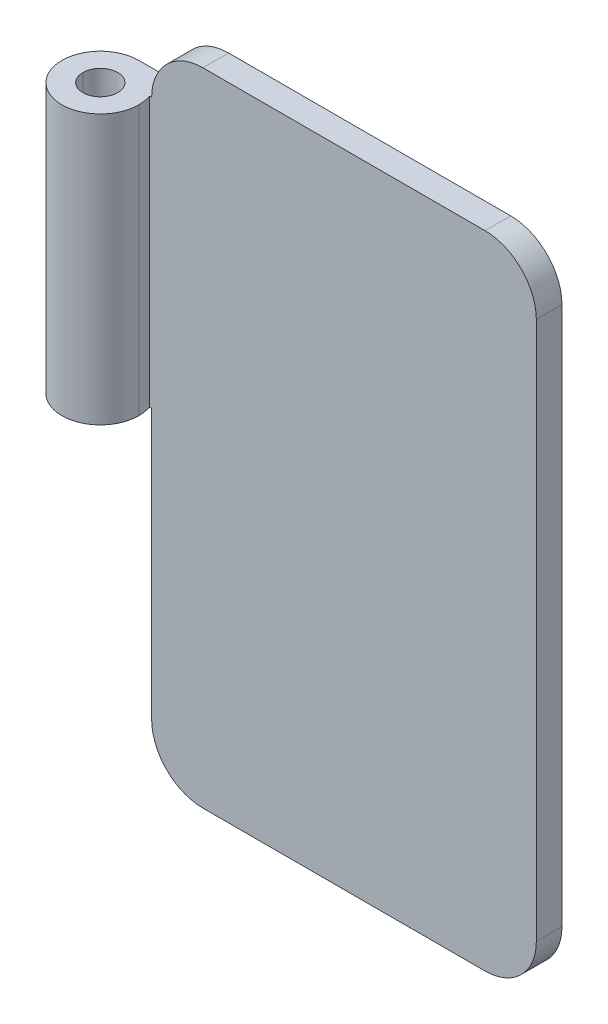
ISO-10303-21;
HEADER;
FILE_DESCRIPTION(('STEP AP214'),'2;1');
FILE_NAME('part.step','',(''),(''),'','','');
FILE_SCHEMA(('AUTOMOTIVE_DESIGN { 1 0 10303 214 1 1 1 1 }'));
ENDSEC;
DATA;
#1=APPLICATION_CONTEXT('core data for automotive mechanical design processes');
#2=APPLICATION_PROTOCOL_DEFINITION('international standard','automotive_design',2000,#1);
#3=PRODUCT_CONTEXT('',#1,'mechanical');
#4=PRODUCT('Part','Part','',(#3));
#5=PRODUCT_RELATED_PRODUCT_CATEGORY('part','',(#4));
#6=PRODUCT_DEFINITION_FORMATION('','',#4);
#7=PRODUCT_DEFINITION_CONTEXT('part definition',#1,'design');
#8=PRODUCT_DEFINITION('design','',#6,#7);
#9=PRODUCT_DEFINITION_SHAPE('','',#8);
#10=(LENGTH_UNIT() NAMED_UNIT(*) SI_UNIT(.MILLI.,.METRE.));
#11=(NAMED_UNIT(*) PLANE_ANGLE_UNIT() SI_UNIT($,.RADIAN.));
#12=(NAMED_UNIT(*) SI_UNIT($,.STERADIAN.) SOLID_ANGLE_UNIT());
#13=UNCERTAINTY_MEASURE_WITH_UNIT(LENGTH_MEASURE(1.E-05),#10,'distance_accuracy_value','');
#14=(GEOMETRIC_REPRESENTATION_CONTEXT(3) GLOBAL_UNCERTAINTY_ASSIGNED_CONTEXT((#13)) GLOBAL_UNIT_ASSIGNED_CONTEXT((#10,
#11,#12)) REPRESENTATION_CONTEXT('',''));
#15=CARTESIAN_POINT('',(0.,0.,0.));
#16=DIRECTION('',(0.,0.,1.));
#17=DIRECTION('',(1.,0.,0.));
#18=AXIS2_PLACEMENT_3D('',#15,#16,#17);
#19=CARTESIAN_POINT('',(3.25,14.125,1.5));
#20=DIRECTION('',(0.,1.,0.));
#21=DIRECTION('',(-1.,0.,0.));
#22=AXIS2_PLACEMENT_3D('',#19,#20,#21);
#23=CYLINDRICAL_SURFACE('',#22,0.68);
#24=DIRECTION('',(0.,1.,0.));
#25=VECTOR('',#24,1.);
#26=CARTESIAN_POINT('',(3.93,14.125,1.5));
#27=LINE('',#26,#25);
#28=CARTESIAN_POINT('',(3.93,3.625,1.5));
#29=VERTEX_POINT('',#28);
#30=CARTESIAN_POINT('',(3.93,14.125,1.5));
#31=VERTEX_POINT('',#30);
#32=EDGE_CURVE('E172',#29,#31,#27,.T.);
#33=ORIENTED_EDGE('',*,*,#32,.F.);
#34=CARTESIAN_POINT('',(3.25,3.625,1.5));
#35=DIRECTION('',(0.,1.,0.));
#36=DIRECTION('',(-1.,0.,0.));
#37=AXIS2_PLACEMENT_3D('',#34,#35,#36);
#38=CIRCLE('',#37,0.68);
#39=CARTESIAN_POINT('',(2.57,3.625,1.5));
#40=VERTEX_POINT('',#39);
#41=EDGE_CURVE('E160',#40,#29,#38,.T.);
#42=ORIENTED_EDGE('',*,*,#41,.F.);
#43=DIRECTION('',(0.,1.,0.));
#44=VECTOR('',#43,1.);
#45=CARTESIAN_POINT('',(2.57,14.125,1.5));
#46=LINE('',#45,#44);
#47=CARTESIAN_POINT('',(2.57,14.125,1.5));
#48=VERTEX_POINT('',#47);
#49=EDGE_CURVE('E180',#40,#48,#46,.T.);
#50=ORIENTED_EDGE('',*,*,#49,.T.);
#51=CARTESIAN_POINT('',(3.25,14.125,1.5));
#52=DIRECTION('',(0.,1.,0.));
#53=DIRECTION('',(-1.,0.,0.));
#54=AXIS2_PLACEMENT_3D('',#51,#52,#53);
#55=CIRCLE('',#54,0.68);
#56=EDGE_CURVE('E11',#48,#31,#55,.T.);
#57=ORIENTED_EDGE('',*,*,#56,.T.);
#58=EDGE_LOOP('',(#33,#42,#50,#57));
#59=FACE_BOUND('',#58,.T.);
#60=ADVANCED_FACE('F16',(#59),#23,.F.);
#61=CARTESIAN_POINT('',(3.25,14.125,1.5));
#62=DIRECTION('',(0.,1.,0.));
#63=DIRECTION('',(-1.,0.,0.));
#64=AXIS2_PLACEMENT_3D('',#61,#62,#63);
#65=CYLINDRICAL_SURFACE('',#64,1.5);
#66=DIRECTION('',(0.,1.,0.));
#67=VECTOR('',#66,1.);
#68=CARTESIAN_POINT('',(4.75,14.125,1.5));
#69=LINE('',#68,#67);
#70=CARTESIAN_POINT('',(4.75,3.625,1.5));
#71=VERTEX_POINT('',#70);
#72=CARTESIAN_POINT('',(4.75,14.125,1.5));
#73=VERTEX_POINT('',#72);
#74=EDGE_CURVE('E194',#71,#73,#69,.T.);
#75=ORIENTED_EDGE('',*,*,#74,.F.);
#76=CARTESIAN_POINT('',(3.25,3.625,1.5));
#77=DIRECTION('',(0.,1.,0.));
#78=DIRECTION('',(-1.,0.,0.));
#79=AXIS2_PLACEMENT_3D('',#76,#77,#78);
#80=CIRCLE('',#79,1.5);
#81=CARTESIAN_POINT('',(4.66421356237309,3.625,1.));
#82=VERTEX_POINT('',#81);
#83=EDGE_CURVE('E38',#71,#82,#80,.T.);
#84=ORIENTED_EDGE('',*,*,#83,.T.);
#85=DIRECTION('',(0.,1.,0.));
#86=VECTOR('',#85,1.);
#87=CARTESIAN_POINT('',(4.66421356237309,1.822224362268,1.));
#88=LINE('',#87,#86);
#89=CARTESIAN_POINT('',(4.66421356237309,14.125,1.));
#90=VERTEX_POINT('',#89);
#91=EDGE_CURVE('E317',#82,#90,#88,.T.);
#92=ORIENTED_EDGE('',*,*,#91,.T.);
#93=CARTESIAN_POINT('',(3.25,14.125,1.5));
#94=DIRECTION('',(0.,1.,0.));
#95=DIRECTION('',(-1.,0.,0.));
#96=AXIS2_PLACEMENT_3D('',#93,#94,#95);
#97=CIRCLE('',#96,1.5);
#98=EDGE_CURVE('E25',#73,#90,#97,.T.);
#99=ORIENTED_EDGE('',*,*,#98,.F.);
#100=EDGE_LOOP('',(#75,#84,#92,#99));
#101=FACE_BOUND('',#100,.T.);
#102=ADVANCED_FACE('F18',(#101),#65,.T.);
#103=CARTESIAN_POINT('',(0.,14.125,0.));
#104=DIRECTION('',(0.,1.,0.));
#105=DIRECTION('',(1.,0.,0.));
#106=AXIS2_PLACEMENT_3D('',#103,#104,#105);
#107=PLANE('',#106);
#108=ORIENTED_EDGE('',*,*,#56,.F.);
#109=CARTESIAN_POINT('',(3.25,14.125,1.5));
#110=DIRECTION('',(0.,1.,0.));
#111=DIRECTION('',(-1.,0.,0.));
#112=AXIS2_PLACEMENT_3D('',#109,#110,#111);
#113=CIRCLE('',#112,0.68);
#114=EDGE_CURVE('E177',#31,#48,#113,.T.);
#115=ORIENTED_EDGE('',*,*,#114,.F.);
#116=EDGE_LOOP('',(#108,#115));
#117=FACE_BOUND('',#116,.T.);
#118=DIRECTION('',(-1.,0.,0.));
#119=VECTOR('',#118,1.);
#120=CARTESIAN_POINT('',(0.,14.125,1.));
#121=LINE('',#120,#119);
#122=CARTESIAN_POINT('',(4.75,14.125,1.));
#123=VERTEX_POINT('',#122);
#124=EDGE_CURVE('E313',#123,#90,#121,.T.);
#125=ORIENTED_EDGE('',*,*,#124,.F.);
#126=DIRECTION('',(0.,0.,-1.));
#127=VECTOR('',#126,1.);
#128=CARTESIAN_POINT('',(4.75,14.125,1.));
#129=LINE('',#128,#127);
#130=CARTESIAN_POINT('',(4.75,14.125,0.));
#131=VERTEX_POINT('',#130);
#132=EDGE_CURVE('E195',#123,#131,#129,.T.);
#133=ORIENTED_EDGE('',*,*,#132,.T.);
#134=DIRECTION('',(-1.,0.,0.));
#135=VECTOR('',#134,1.);
#136=CARTESIAN_POINT('',(0.,14.125,0.));
#137=LINE('',#136,#135);
#138=CARTESIAN_POINT('',(3.25,14.125,0.));
#139=VERTEX_POINT('',#138);
#140=EDGE_CURVE('E326',#131,#139,#137,.T.);
#141=ORIENTED_EDGE('',*,*,#140,.T.);
#142=CARTESIAN_POINT('',(3.25,14.125,1.5));
#143=DIRECTION('',(0.,1.,0.));
#144=DIRECTION('',(-1.,0.,0.));
#145=AXIS2_PLACEMENT_3D('',#142,#143,#144);
#146=CIRCLE('',#145,1.5);
#147=CARTESIAN_POINT('',(1.75,14.125,1.5));
#148=VERTEX_POINT('',#147);
#149=EDGE_CURVE('E209',#139,#148,#146,.T.);
#150=ORIENTED_EDGE('',*,*,#149,.T.);
#151=CARTESIAN_POINT('',(3.25,14.125,1.5));
#152=DIRECTION('',(0.,1.,0.));
#153=DIRECTION('',(-1.,0.,0.));
#154=AXIS2_PLACEMENT_3D('',#151,#152,#153);
#155=CIRCLE('',#154,1.5);
#156=EDGE_CURVE('E213',#148,#73,#155,.T.);
#157=ORIENTED_EDGE('',*,*,#156,.T.);
#158=ORIENTED_EDGE('',*,*,#98,.T.);
#159=EDGE_LOOP('',(#125,#133,#141,#150,#157,#158));
#160=FACE_BOUND('',#159,.T.);
#161=ADVANCED_FACE('F610',(#117,#160),#107,.T.);
#162=CARTESIAN_POINT('',(0.,3.625,1.5));
#163=DIRECTION('',(0.,-1.,0.));
#164=DIRECTION('',(0.,0.,-1.));
#165=AXIS2_PLACEMENT_3D('',#162,#163,#164);
#166=PLANE('',#165);
#167=ORIENTED_EDGE('',*,*,#41,.T.);
#168=CARTESIAN_POINT('',(3.25,3.625,1.5));
#169=DIRECTION('',(0.,1.,0.));
#170=DIRECTION('',(-1.,0.,0.));
#171=AXIS2_PLACEMENT_3D('',#168,#169,#170);
#172=CIRCLE('',#171,0.68);
#173=EDGE_CURVE('E165',#29,#40,#172,.T.);
#174=ORIENTED_EDGE('',*,*,#173,.T.);
#175=EDGE_LOOP('',(#167,#174));
#176=FACE_BOUND('',#175,.T.);
#177=DIRECTION('',(0.,0.,-1.));
#178=VECTOR('',#177,1.);
#179=CARTESIAN_POINT('',(4.75,3.625,0.));
#180=LINE('',#179,#178);
#181=CARTESIAN_POINT('',(4.75,3.625,1.));
#182=VERTEX_POINT('',#181);
#183=CARTESIAN_POINT('',(4.75,3.625,0.));
#184=VERTEX_POINT('',#183);
#185=EDGE_CURVE('E244',#182,#184,#180,.T.);
#186=ORIENTED_EDGE('',*,*,#185,.F.);
#187=DIRECTION('',(-1.,0.,0.));
#188=VECTOR('',#187,1.);
#189=CARTESIAN_POINT('',(0.,3.625,1.));
#190=LINE('',#189,#188);
#191=EDGE_CURVE('E320',#182,#82,#190,.T.);
#192=ORIENTED_EDGE('',*,*,#191,.T.);
#193=ORIENTED_EDGE('',*,*,#83,.F.);
#194=CARTESIAN_POINT('',(3.25,3.625,1.5));
#195=DIRECTION('',(0.,1.,0.));
#196=DIRECTION('',(-1.,0.,0.));
#197=AXIS2_PLACEMENT_3D('',#194,#195,#196);
#198=CIRCLE('',#197,1.5);
#199=CARTESIAN_POINT('',(1.75,3.625,1.5));
#200=VERTEX_POINT('',#199);
#201=EDGE_CURVE('E190',#200,#71,#198,.T.);
#202=ORIENTED_EDGE('',*,*,#201,.F.);
#203=CARTESIAN_POINT('',(3.25,3.625,1.5));
#204=DIRECTION('',(0.,1.,0.));
#205=DIRECTION('',(-1.,0.,0.));
#206=AXIS2_PLACEMENT_3D('',#203,#204,#205);
#207=CIRCLE('',#206,1.5);
#208=CARTESIAN_POINT('',(3.25,3.625,0.));
#209=VERTEX_POINT('',#208);
#210=EDGE_CURVE('E216',#209,#200,#207,.T.);
#211=ORIENTED_EDGE('',*,*,#210,.F.);
#212=DIRECTION('',(-1.,0.,0.));
#213=VECTOR('',#212,1.);
#214=CARTESIAN_POINT('',(0.,3.625,0.));
#215=LINE('',#214,#213);
#216=EDGE_CURVE('E323',#184,#209,#215,.T.);
#217=ORIENTED_EDGE('',*,*,#216,.F.);
#218=EDGE_LOOP('',(#186,#192,#193,#202,#211,#217));
#219=FACE_BOUND('',#218,.T.);
#220=ADVANCED_FACE('F162',(#176,#219),#166,.T.);
#221=CARTESIAN_POINT('',(6.75,14.125,0.));
#222=DIRECTION('',(0.,0.,1.));
#223=DIRECTION('',(1.,0.,0.));
#224=AXIS2_PLACEMENT_3D('',#221,#222,#223);
#225=PLANE('',#224);
#226=CARTESIAN_POINT('',(6.75,14.125,0.));
#227=DIRECTION('',(0.,0.,1.));
#228=DIRECTION('',(1.,0.,0.));
#229=AXIS2_PLACEMENT_3D('',#226,#227,#228);
#230=CIRCLE('',#229,2.);
#231=CARTESIAN_POINT('',(6.75,16.125,0.));
#232=VERTEX_POINT('',#231);
#233=EDGE_CURVE('E200',#232,#131,#230,.T.);
#234=ORIENTED_EDGE('',*,*,#233,.F.);
#235=DIRECTION('',(-1.,0.,0.));
#236=VECTOR('',#235,1.);
#237=CARTESIAN_POINT('',(17.75,16.125,0.));
#238=LINE('',#237,#236);
#239=CARTESIAN_POINT('',(17.75,16.125,0.));
#240=VERTEX_POINT('',#239);
#241=EDGE_CURVE('E228',#240,#232,#238,.T.);
#242=ORIENTED_EDGE('',*,*,#241,.F.);
#243=CARTESIAN_POINT('',(17.75,14.125,0.));
#244=DIRECTION('',(0.,0.,1.));
#245=DIRECTION('',(1.,0.,0.));
#246=AXIS2_PLACEMENT_3D('',#243,#244,#245);
#247=CIRCLE('',#246,2.);
#248=CARTESIAN_POINT('',(19.75,14.125,0.));
#249=VERTEX_POINT('',#248);
#250=EDGE_CURVE('E304',#249,#240,#247,.T.);
#251=ORIENTED_EDGE('',*,*,#250,.F.);
#252=DIRECTION('',(0.,1.,0.));
#253=VECTOR('',#252,1.);
#254=CARTESIAN_POINT('',(19.75,-6.875,0.));
#255=LINE('',#254,#253);
#256=CARTESIAN_POINT('',(19.75,-6.875,0.));
#257=VERTEX_POINT('',#256);
#258=EDGE_CURVE('E277',#257,#249,#255,.T.);
#259=ORIENTED_EDGE('',*,*,#258,.F.);
#260=CARTESIAN_POINT('',(17.75,-6.875,0.));
#261=DIRECTION('',(0.,0.,1.));
#262=DIRECTION('',(1.,0.,0.));
#263=AXIS2_PLACEMENT_3D('',#260,#261,#262);
#264=CIRCLE('',#263,2.);
#265=CARTESIAN_POINT('',(17.75,-8.875,0.));
#266=VERTEX_POINT('',#265);
#267=EDGE_CURVE('E286',#266,#257,#264,.T.);
#268=ORIENTED_EDGE('',*,*,#267,.F.);
#269=DIRECTION('',(1.,0.,0.));
#270=VECTOR('',#269,1.);
#271=CARTESIAN_POINT('',(17.75,-8.875,0.));
#272=LINE('',#271,#270);
#273=CARTESIAN_POINT('',(6.75,-8.875,0.));
#274=VERTEX_POINT('',#273);
#275=EDGE_CURVE('E268',#274,#266,#272,.T.);
#276=ORIENTED_EDGE('',*,*,#275,.F.);
#277=CARTESIAN_POINT('',(6.75,-6.875,0.));
#278=DIRECTION('',(0.,0.,1.));
#279=DIRECTION('',(1.,0.,0.));
#280=AXIS2_PLACEMENT_3D('',#277,#278,#279);
#281=CIRCLE('',#280,2.);
#282=CARTESIAN_POINT('',(4.75,-6.875,0.));
#283=VERTEX_POINT('',#282);
#284=EDGE_CURVE('E256',#283,#274,#281,.T.);
#285=ORIENTED_EDGE('',*,*,#284,.F.);
#286=DIRECTION('',(0.,-1.,0.));
#287=VECTOR('',#286,1.);
#288=CARTESIAN_POINT('',(4.75,-6.875,0.));
#289=LINE('',#288,#287);
#290=EDGE_CURVE('E248',#184,#283,#289,.T.);
#291=ORIENTED_EDGE('',*,*,#290,.F.);
#292=ORIENTED_EDGE('',*,*,#216,.T.);
#293=DIRECTION('',(0.,1.,0.));
#294=VECTOR('',#293,1.);
#295=CARTESIAN_POINT('',(3.25,1.822224362268,0.));
#296=LINE('',#295,#294);
#297=EDGE_CURVE('E205',#209,#139,#296,.T.);
#298=ORIENTED_EDGE('',*,*,#297,.T.);
#299=ORIENTED_EDGE('',*,*,#140,.F.);
#300=EDGE_LOOP('',(#234,#242,#251,#259,#268,#276,#285,#291,#292,#298,#299));
#301=FACE_BOUND('',#300,.T.);
#302=ADVANCED_FACE('F671',(#301),#225,.F.);
#303=CARTESIAN_POINT('',(6.75,14.125,1.));
#304=DIRECTION('',(0.,0.,1.));
#305=DIRECTION('',(1.,0.,0.));
#306=AXIS2_PLACEMENT_3D('',#303,#304,#305);
#307=PLANE('',#306);
#308=CARTESIAN_POINT('',(6.75,14.125,1.));
#309=DIRECTION('',(0.,0.,1.));
#310=DIRECTION('',(1.,0.,0.));
#311=AXIS2_PLACEMENT_3D('',#308,#309,#310);
#312=CIRCLE('',#311,2.);
#313=CARTESIAN_POINT('',(6.75,16.125,1.));
#314=VERTEX_POINT('',#313);
#315=EDGE_CURVE('E199',#314,#123,#312,.T.);
#316=ORIENTED_EDGE('',*,*,#315,.T.);
#317=ORIENTED_EDGE('',*,*,#124,.T.);
#318=ORIENTED_EDGE('',*,*,#91,.F.);
#319=ORIENTED_EDGE('',*,*,#191,.F.);
#320=DIRECTION('',(0.,-1.,0.));
#321=VECTOR('',#320,1.);
#322=CARTESIAN_POINT('',(4.75,-6.875,1.));
#323=LINE('',#322,#321);
#324=CARTESIAN_POINT('',(4.75,-6.875,1.));
#325=VERTEX_POINT('',#324);
#326=EDGE_CURVE('E240',#182,#325,#323,.T.);
#327=ORIENTED_EDGE('',*,*,#326,.T.);
#328=CARTESIAN_POINT('',(6.75,-6.875,1.));
#329=DIRECTION('',(0.,0.,1.));
#330=DIRECTION('',(1.,0.,0.));
#331=AXIS2_PLACEMENT_3D('',#328,#329,#330);
#332=CIRCLE('',#331,2.);
#333=CARTESIAN_POINT('',(6.75,-8.875,1.));
#334=VERTEX_POINT('',#333);
#335=EDGE_CURVE('E264',#325,#334,#332,.T.);
#336=ORIENTED_EDGE('',*,*,#335,.T.);
#337=DIRECTION('',(1.,0.,0.));
#338=VECTOR('',#337,1.);
#339=CARTESIAN_POINT('',(17.75,-8.875,1.));
#340=LINE('',#339,#338);
#341=CARTESIAN_POINT('',(17.75,-8.875,1.));
#342=VERTEX_POINT('',#341);
#343=EDGE_CURVE('E276',#334,#342,#340,.T.);
#344=ORIENTED_EDGE('',*,*,#343,.T.);
#345=CARTESIAN_POINT('',(17.75,-6.875,1.));
#346=DIRECTION('',(0.,0.,1.));
#347=DIRECTION('',(1.,0.,0.));
#348=AXIS2_PLACEMENT_3D('',#345,#346,#347);
#349=CIRCLE('',#348,2.);
#350=CARTESIAN_POINT('',(19.75,-6.875,1.));
#351=VERTEX_POINT('',#350);
#352=EDGE_CURVE('E282',#342,#351,#349,.T.);
#353=ORIENTED_EDGE('',*,*,#352,.T.);
#354=DIRECTION('',(0.,1.,0.));
#355=VECTOR('',#354,1.);
#356=CARTESIAN_POINT('',(19.75,-6.875,1.));
#357=LINE('',#356,#355);
#358=CARTESIAN_POINT('',(19.75,14.125,1.));
#359=VERTEX_POINT('',#358);
#360=EDGE_CURVE('E300',#351,#359,#357,.T.);
#361=ORIENTED_EDGE('',*,*,#360,.T.);
#362=CARTESIAN_POINT('',(17.75,14.125,1.));
#363=DIRECTION('',(0.,0.,1.));
#364=DIRECTION('',(1.,0.,0.));
#365=AXIS2_PLACEMENT_3D('',#362,#363,#364);
#366=CIRCLE('',#365,2.);
#367=CARTESIAN_POINT('',(17.75,16.125,1.));
#368=VERTEX_POINT('',#367);
#369=EDGE_CURVE('E232',#359,#368,#366,.T.);
#370=ORIENTED_EDGE('',*,*,#369,.T.);
#371=DIRECTION('',(-1.,0.,0.));
#372=VECTOR('',#371,1.);
#373=CARTESIAN_POINT('',(17.75,16.125,1.));
#374=LINE('',#373,#372);
#375=EDGE_CURVE('E231',#368,#314,#374,.T.);
#376=ORIENTED_EDGE('',*,*,#375,.T.);
#377=EDGE_LOOP('',(#316,#317,#318,#319,#327,#336,#344,#353,#361,#370,#376));
#378=FACE_BOUND('',#377,.T.);
#379=ADVANCED_FACE('F676',(#378),#307,.T.);
#380=CARTESIAN_POINT('',(17.75,16.125,1.));
#381=DIRECTION('',(0.,-1.,0.));
#382=DIRECTION('',(0.,0.,-1.));
#383=AXIS2_PLACEMENT_3D('',#380,#381,#382);
#384=PLANE('',#383);
#385=ORIENTED_EDGE('',*,*,#241,.T.);
#386=DIRECTION('',(0.,0.,-1.));
#387=VECTOR('',#386,1.);
#388=CARTESIAN_POINT('',(6.75,16.125,1.));
#389=LINE('',#388,#387);
#390=EDGE_CURVE('E204',#314,#232,#389,.T.);
#391=ORIENTED_EDGE('',*,*,#390,.F.);
#392=ORIENTED_EDGE('',*,*,#375,.F.);
#393=DIRECTION('',(0.,0.,-1.));
#394=VECTOR('',#393,1.);
#395=CARTESIAN_POINT('',(17.75,16.125,1.));
#396=LINE('',#395,#394);
#397=EDGE_CURVE('E236',#368,#240,#396,.T.);
#398=ORIENTED_EDGE('',*,*,#397,.T.);
#399=EDGE_LOOP('',(#385,#391,#392,#398));
#400=FACE_BOUND('',#399,.T.);
#401=ADVANCED_FACE('F662',(#400),#384,.F.);
#402=CARTESIAN_POINT('',(17.75,14.125,1.));
#403=DIRECTION('',(0.,0.,-1.));
#404=DIRECTION('',(-1.,0.,0.));
#405=AXIS2_PLACEMENT_3D('',#402,#403,#404);
#406=CYLINDRICAL_SURFACE('',#405,2.);
#407=ORIENTED_EDGE('',*,*,#250,.T.);
#408=ORIENTED_EDGE('',*,*,#397,.F.);
#409=ORIENTED_EDGE('',*,*,#369,.F.);
#410=DIRECTION('',(0.,0.,-1.));
#411=VECTOR('',#410,1.);
#412=CARTESIAN_POINT('',(19.75,14.125,1.));
#413=LINE('',#412,#411);
#414=EDGE_CURVE('E281',#359,#249,#413,.T.);
#415=ORIENTED_EDGE('',*,*,#414,.T.);
#416=EDGE_LOOP('',(#407,#408,#409,#415));
#417=FACE_BOUND('',#416,.T.);
#418=ADVANCED_FACE('F576',(#417),#406,.T.);
#419=CARTESIAN_POINT('',(19.75,-6.875,1.));
#420=DIRECTION('',(-1.,0.,0.));
#421=DIRECTION('',(0.,0.,1.));
#422=AXIS2_PLACEMENT_3D('',#419,#420,#421);
#423=PLANE('',#422);
#424=ORIENTED_EDGE('',*,*,#258,.T.);
#425=ORIENTED_EDGE('',*,*,#414,.F.);
#426=ORIENTED_EDGE('',*,*,#360,.F.);
#427=DIRECTION('',(0.,0.,-1.));
#428=VECTOR('',#427,1.);
#429=CARTESIAN_POINT('',(19.75,-6.875,1.));
#430=LINE('',#429,#428);
#431=EDGE_CURVE('E290',#351,#257,#430,.T.);
#432=ORIENTED_EDGE('',*,*,#431,.T.);
#433=EDGE_LOOP('',(#424,#425,#426,#432));
#434=FACE_BOUND('',#433,.T.);
#435=ADVANCED_FACE('F571',(#434),#423,.F.);
#436=CARTESIAN_POINT('',(17.75,-6.875,1.));
#437=DIRECTION('',(0.,0.,-1.));
#438=DIRECTION('',(-1.,0.,0.));
#439=AXIS2_PLACEMENT_3D('',#436,#437,#438);
#440=CYLINDRICAL_SURFACE('',#439,2.);
#441=ORIENTED_EDGE('',*,*,#267,.T.);
#442=ORIENTED_EDGE('',*,*,#431,.F.);
#443=ORIENTED_EDGE('',*,*,#352,.F.);
#444=DIRECTION('',(0.,0.,-1.));
#445=VECTOR('',#444,1.);
#446=CARTESIAN_POINT('',(17.75,-8.875,1.));
#447=LINE('',#446,#445);
#448=EDGE_CURVE('E272',#342,#266,#447,.T.);
#449=ORIENTED_EDGE('',*,*,#448,.T.);
#450=EDGE_LOOP('',(#441,#442,#443,#449));
#451=FACE_BOUND('',#450,.T.);
#452=ADVANCED_FACE('F575',(#451),#440,.T.);
#453=CARTESIAN_POINT('',(17.75,-8.875,1.));
#454=DIRECTION('',(0.,1.,0.));
#455=DIRECTION('',(1.,0.,0.));
#456=AXIS2_PLACEMENT_3D('',#453,#454,#455);
#457=PLANE('',#456);
#458=ORIENTED_EDGE('',*,*,#275,.T.);
#459=ORIENTED_EDGE('',*,*,#448,.F.);
#460=ORIENTED_EDGE('',*,*,#343,.F.);
#461=DIRECTION('',(0.,0.,-1.));
#462=VECTOR('',#461,1.);
#463=CARTESIAN_POINT('',(6.75,-8.875,1.));
#464=LINE('',#463,#462);
#465=EDGE_CURVE('E260',#334,#274,#464,.T.);
#466=ORIENTED_EDGE('',*,*,#465,.T.);
#467=EDGE_LOOP('',(#458,#459,#460,#466));
#468=FACE_BOUND('',#467,.T.);
#469=ADVANCED_FACE('F630',(#468),#457,.F.);
#470=CARTESIAN_POINT('',(6.75,-6.875,1.));
#471=DIRECTION('',(0.,0.,-1.));
#472=DIRECTION('',(-1.,0.,0.));
#473=AXIS2_PLACEMENT_3D('',#470,#471,#472);
#474=CYLINDRICAL_SURFACE('',#473,2.);
#475=ORIENTED_EDGE('',*,*,#284,.T.);
#476=ORIENTED_EDGE('',*,*,#465,.F.);
#477=ORIENTED_EDGE('',*,*,#335,.F.);
#478=DIRECTION('',(0.,0.,-1.));
#479=VECTOR('',#478,1.);
#480=CARTESIAN_POINT('',(4.75,-6.875,1.));
#481=LINE('',#480,#479);
#482=EDGE_CURVE('E252',#325,#283,#481,.T.);
#483=ORIENTED_EDGE('',*,*,#482,.T.);
#484=EDGE_LOOP('',(#475,#476,#477,#483));
#485=FACE_BOUND('',#484,.T.);
#486=ADVANCED_FACE('F587',(#485),#474,.T.);
#487=CARTESIAN_POINT('',(4.75,-6.875,1.));
#488=DIRECTION('',(1.,0.,0.));
#489=DIRECTION('',(0.,1.,0.));
#490=AXIS2_PLACEMENT_3D('',#487,#488,#489);
#491=PLANE('',#490);
#492=ORIENTED_EDGE('',*,*,#326,.F.);
#493=ORIENTED_EDGE('',*,*,#185,.T.);
#494=ORIENTED_EDGE('',*,*,#290,.T.);
#495=ORIENTED_EDGE('',*,*,#482,.F.);
#496=EDGE_LOOP('',(#492,#493,#494,#495));
#497=FACE_BOUND('',#496,.T.);
#498=ADVANCED_FACE('F582',(#497),#491,.F.);
#499=CARTESIAN_POINT('',(6.75,14.125,1.));
#500=DIRECTION('',(0.,0.,-1.));
#501=DIRECTION('',(-1.,0.,0.));
#502=AXIS2_PLACEMENT_3D('',#499,#500,#501);
#503=CYLINDRICAL_SURFACE('',#502,2.);
#504=ORIENTED_EDGE('',*,*,#233,.T.);
#505=ORIENTED_EDGE('',*,*,#132,.F.);
#506=ORIENTED_EDGE('',*,*,#315,.F.);
#507=ORIENTED_EDGE('',*,*,#390,.T.);
#508=EDGE_LOOP('',(#504,#505,#506,#507));
#509=FACE_BOUND('',#508,.T.);
#510=ADVANCED_FACE('F586',(#509),#503,.T.);
#511=CARTESIAN_POINT('',(3.25,14.125,1.5));
#512=DIRECTION('',(0.,1.,0.));
#513=DIRECTION('',(-1.,0.,0.));
#514=AXIS2_PLACEMENT_3D('',#511,#512,#513);
#515=CYLINDRICAL_SURFACE('',#514,1.5);
#516=ORIENTED_EDGE('',*,*,#210,.T.);
#517=DIRECTION('',(0.,1.,0.));
#518=VECTOR('',#517,1.);
#519=CARTESIAN_POINT('',(1.75,14.125,1.5));
#520=LINE('',#519,#518);
#521=EDGE_CURVE('E217',#200,#148,#520,.T.);
#522=ORIENTED_EDGE('',*,*,#521,.T.);
#523=ORIENTED_EDGE('',*,*,#149,.F.);
#524=ORIENTED_EDGE('',*,*,#297,.F.);
#525=EDGE_LOOP('',(#516,#522,#523,#524));
#526=FACE_BOUND('',#525,.T.);
#527=ADVANCED_FACE('F596',(#526),#515,.T.);
#528=CARTESIAN_POINT('',(3.25,14.125,1.5));
#529=DIRECTION('',(0.,1.,0.));
#530=DIRECTION('',(-1.,0.,0.));
#531=AXIS2_PLACEMENT_3D('',#528,#529,#530);
#532=CYLINDRICAL_SURFACE('',#531,1.5);
#533=ORIENTED_EDGE('',*,*,#201,.T.);
#534=ORIENTED_EDGE('',*,*,#74,.T.);
#535=ORIENTED_EDGE('',*,*,#156,.F.);
#536=ORIENTED_EDGE('',*,*,#521,.F.);
#537=EDGE_LOOP('',(#533,#534,#535,#536));
#538=FACE_BOUND('',#537,.T.);
#539=ADVANCED_FACE('F567',(#538),#532,.T.);
#540=CARTESIAN_POINT('',(3.25,14.125,1.5));
#541=DIRECTION('',(0.,1.,0.));
#542=DIRECTION('',(-1.,0.,0.));
#543=AXIS2_PLACEMENT_3D('',#540,#541,#542);
#544=CYLINDRICAL_SURFACE('',#543,0.68);
#545=ORIENTED_EDGE('',*,*,#173,.F.);
#546=ORIENTED_EDGE('',*,*,#32,.T.);
#547=ORIENTED_EDGE('',*,*,#114,.T.);
#548=ORIENTED_EDGE('',*,*,#49,.F.);
#549=EDGE_LOOP('',(#545,#546,#547,#548));
#550=FACE_BOUND('',#549,.T.);
#551=ADVANCED_FACE('F179',(#550),#544,.F.);
#552=CLOSED_SHELL('',(#60,#102,#161,#220,#302,#379,#401,#418,#435,#452,#469,#486,#498,#510,#527,
#539,#551));
#553=MANIFOLD_SOLID_BREP('B1',#552);
#554=ADVANCED_BREP_SHAPE_REPRESENTATION('',(#18,#553),#14);
#555=SHAPE_DEFINITION_REPRESENTATION(#9,#554);
ENDSEC;
END-ISO-10303-21;
